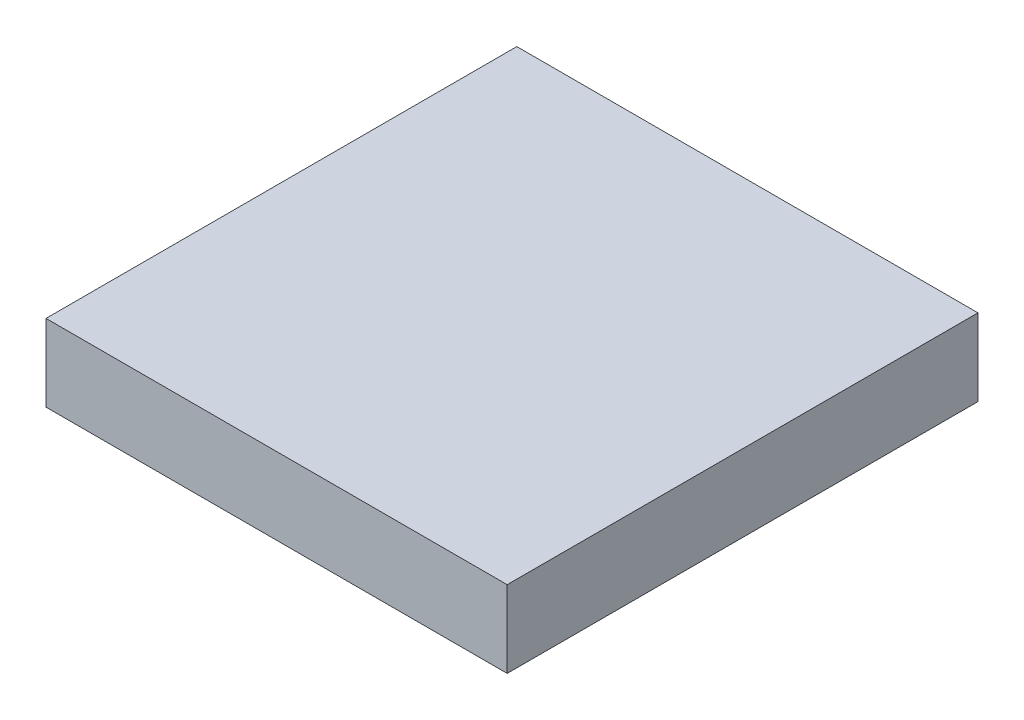
ISO-10303-21;
HEADER;
FILE_DESCRIPTION(('STEP AP214'),'2;1');
FILE_NAME('part.step','',(''),(''),'','','');
FILE_SCHEMA(('AUTOMOTIVE_DESIGN { 1 0 10303 214 1 1 1 1 }'));
ENDSEC;
DATA;
#1=APPLICATION_CONTEXT('core data for automotive mechanical design processes');
#2=APPLICATION_PROTOCOL_DEFINITION('international standard','automotive_design',2000,#1);
#3=PRODUCT_CONTEXT('',#1,'mechanical');
#4=PRODUCT('Part','Part','',(#3));
#5=PRODUCT_RELATED_PRODUCT_CATEGORY('part','',(#4));
#6=PRODUCT_DEFINITION_FORMATION('','',#4);
#7=PRODUCT_DEFINITION_CONTEXT('part definition',#1,'design');
#8=PRODUCT_DEFINITION('design','',#6,#7);
#9=PRODUCT_DEFINITION_SHAPE('','',#8);
#10=(LENGTH_UNIT() NAMED_UNIT(*) SI_UNIT(.MILLI.,.METRE.));
#11=(NAMED_UNIT(*) PLANE_ANGLE_UNIT() SI_UNIT($,.RADIAN.));
#12=(NAMED_UNIT(*) SI_UNIT($,.STERADIAN.) SOLID_ANGLE_UNIT());
#13=UNCERTAINTY_MEASURE_WITH_UNIT(LENGTH_MEASURE(1.E-05),#10,'distance_accuracy_value','');
#14=(GEOMETRIC_REPRESENTATION_CONTEXT(3) GLOBAL_UNCERTAINTY_ASSIGNED_CONTEXT((#13)) GLOBAL_UNIT_ASSIGNED_CONTEXT((#10,
#11,#12)) REPRESENTATION_CONTEXT('',''));
#15=CARTESIAN_POINT('',(0.,0.,0.));
#16=DIRECTION('',(0.,0.,1.));
#17=DIRECTION('',(1.,0.,0.));
#18=AXIS2_PLACEMENT_3D('',#15,#16,#17);
#19=CARTESIAN_POINT('',(0.,20.,0.));
#20=DIRECTION('',(1.,0.,0.));
#21=DIRECTION('',(0.,0.,-1.));
#22=AXIS2_PLACEMENT_3D('',#19,#20,#21);
#23=PLANE('',#22);
#24=DIRECTION('',(0.,0.,1.));
#25=VECTOR('',#24,1.);
#26=CARTESIAN_POINT('',(0.,0.,0.));
#27=LINE('',#26,#25);
#28=CARTESIAN_POINT('',(0.,0.,-122.5));
#29=VERTEX_POINT('',#28);
#30=CARTESIAN_POINT('',(0.,0.,0.));
#31=VERTEX_POINT('',#30);
#32=EDGE_CURVE('E144',#29,#31,#27,.T.);
#33=ORIENTED_EDGE('',*,*,#32,.T.);
#34=DIRECTION('',(0.,-1.,0.));
#35=VECTOR('',#34,1.);
#36=CARTESIAN_POINT('',(0.,20.,0.));
#37=LINE('',#36,#35);
#38=CARTESIAN_POINT('',(0.,20.,0.));
#39=VERTEX_POINT('',#38);
#40=EDGE_CURVE('E12',#39,#31,#37,.T.);
#41=ORIENTED_EDGE('',*,*,#40,.F.);
#42=DIRECTION('',(0.,0.,1.));
#43=VECTOR('',#42,1.);
#44=CARTESIAN_POINT('',(0.,20.,0.));
#45=LINE('',#44,#43);
#46=CARTESIAN_POINT('',(0.,20.,-122.5));
#47=VERTEX_POINT('',#46);
#48=EDGE_CURVE('E146',#47,#39,#45,.T.);
#49=ORIENTED_EDGE('',*,*,#48,.F.);
#50=DIRECTION('',(0.,-1.,0.));
#51=VECTOR('',#50,1.);
#52=CARTESIAN_POINT('',(0.,20.,-122.5));
#53=LINE('',#52,#51);
#54=EDGE_CURVE('E152',#47,#29,#53,.T.);
#55=ORIENTED_EDGE('',*,*,#54,.T.);
#56=EDGE_LOOP('',(#33,#41,#49,#55));
#57=FACE_BOUND('',#56,.T.);
#58=ADVANCED_FACE('F37',(#57),#23,.F.);
#59=CARTESIAN_POINT('',(0.,20.,0.));
#60=DIRECTION('',(0.,0.,-1.));
#61=DIRECTION('',(-1.,0.,0.));
#62=AXIS2_PLACEMENT_3D('',#59,#60,#61);
#63=PLANE('',#62);
#64=DIRECTION('',(1.,0.,0.));
#65=VECTOR('',#64,1.);
#66=CARTESIAN_POINT('',(0.,0.,0.));
#67=LINE('',#66,#65);
#68=CARTESIAN_POINT('',(120.,0.,0.));
#69=VERTEX_POINT('',#68);
#70=EDGE_CURVE('E155',#31,#69,#67,.T.);
#71=ORIENTED_EDGE('',*,*,#70,.T.);
#72=DIRECTION('',(0.,-1.,0.));
#73=VECTOR('',#72,1.);
#74=CARTESIAN_POINT('',(120.,20.,0.));
#75=LINE('',#74,#73);
#76=CARTESIAN_POINT('',(120.,20.,0.));
#77=VERTEX_POINT('',#76);
#78=EDGE_CURVE('E44',#77,#69,#75,.T.);
#79=ORIENTED_EDGE('',*,*,#78,.F.);
#80=DIRECTION('',(1.,0.,0.));
#81=VECTOR('',#80,1.);
#82=CARTESIAN_POINT('',(0.,20.,0.));
#83=LINE('',#82,#81);
#84=EDGE_CURVE('E88',#39,#77,#83,.T.);
#85=ORIENTED_EDGE('',*,*,#84,.F.);
#86=ORIENTED_EDGE('',*,*,#40,.T.);
#87=EDGE_LOOP('',(#71,#79,#85,#86));
#88=FACE_BOUND('',#87,.T.);
#89=ADVANCED_FACE('F181',(#88),#63,.F.);
#90=CARTESIAN_POINT('',(120.,20.,0.));
#91=DIRECTION('',(-1.,0.,0.));
#92=DIRECTION('',(0.,0.,1.));
#93=AXIS2_PLACEMENT_3D('',#90,#91,#92);
#94=PLANE('',#93);
#95=DIRECTION('',(0.,0.,-1.));
#96=VECTOR('',#95,1.);
#97=CARTESIAN_POINT('',(120.,0.,0.));
#98=LINE('',#97,#96);
#99=CARTESIAN_POINT('',(120.,0.,-122.5));
#100=VERTEX_POINT('',#99);
#101=EDGE_CURVE('E157',#69,#100,#98,.T.);
#102=ORIENTED_EDGE('',*,*,#101,.T.);
#103=DIRECTION('',(0.,-1.,0.));
#104=VECTOR('',#103,1.);
#105=CARTESIAN_POINT('',(120.,20.,-122.5));
#106=LINE('',#105,#104);
#107=CARTESIAN_POINT('',(120.,20.,-122.5));
#108=VERTEX_POINT('',#107);
#109=EDGE_CURVE('E161',#108,#100,#106,.T.);
#110=ORIENTED_EDGE('',*,*,#109,.F.);
#111=DIRECTION('',(0.,0.,-1.));
#112=VECTOR('',#111,1.);
#113=CARTESIAN_POINT('',(120.,20.,0.));
#114=LINE('',#113,#112);
#115=EDGE_CURVE('E149',#77,#108,#114,.T.);
#116=ORIENTED_EDGE('',*,*,#115,.F.);
#117=ORIENTED_EDGE('',*,*,#78,.T.);
#118=EDGE_LOOP('',(#102,#110,#116,#117));
#119=FACE_BOUND('',#118,.T.);
#120=ADVANCED_FACE('F166',(#119),#94,.F.);
#121=CARTESIAN_POINT('',(0.,20.,-122.5));
#122=DIRECTION('',(0.,0.,1.));
#123=DIRECTION('',(1.,0.,0.));
#124=AXIS2_PLACEMENT_3D('',#121,#122,#123);
#125=PLANE('',#124);
#126=DIRECTION('',(-1.,0.,0.));
#127=VECTOR('',#126,1.);
#128=CARTESIAN_POINT('',(0.,0.,-122.5));
#129=LINE('',#128,#127);
#130=EDGE_CURVE('E81',#100,#29,#129,.T.);
#131=ORIENTED_EDGE('',*,*,#130,.T.);
#132=ORIENTED_EDGE('',*,*,#54,.F.);
#133=DIRECTION('',(-1.,0.,0.));
#134=VECTOR('',#133,1.);
#135=CARTESIAN_POINT('',(0.,20.,-122.5));
#136=LINE('',#135,#134);
#137=EDGE_CURVE('E60',#108,#47,#136,.T.);
#138=ORIENTED_EDGE('',*,*,#137,.F.);
#139=ORIENTED_EDGE('',*,*,#109,.T.);
#140=EDGE_LOOP('',(#131,#132,#138,#139));
#141=FACE_BOUND('',#140,.T.);
#142=ADVANCED_FACE('F172',(#141),#125,.F.);
#143=CARTESIAN_POINT('',(0.,20.,0.));
#144=DIRECTION('',(0.,-1.,0.));
#145=DIRECTION('',(0.,0.,-1.));
#146=AXIS2_PLACEMENT_3D('',#143,#144,#145);
#147=PLANE('',#146);
#148=ORIENTED_EDGE('',*,*,#48,.T.);
#149=ORIENTED_EDGE('',*,*,#84,.T.);
#150=ORIENTED_EDGE('',*,*,#115,.T.);
#151=ORIENTED_EDGE('',*,*,#137,.T.);
#152=EDGE_LOOP('',(#148,#149,#150,#151));
#153=FACE_BOUND('',#152,.T.);
#154=ADVANCED_FACE('F174',(#153),#147,.F.);
#155=CARTESIAN_POINT('',(0.,0.,0.));
#156=DIRECTION('',(0.,-1.,0.));
#157=DIRECTION('',(0.,0.,-1.));
#158=AXIS2_PLACEMENT_3D('',#155,#156,#157);
#159=PLANE('',#158);
#160=DIRECTION('',(-1.,0.,0.));
#161=VECTOR('',#160,1.);
#162=CARTESIAN_POINT('',(119.,0.,-1.));
#163=LINE('',#162,#161);
#164=CARTESIAN_POINT('',(119.,0.,-1.));
#165=VERTEX_POINT('',#164);
#166=CARTESIAN_POINT('',(1.,0.,-1.));
#167=VERTEX_POINT('',#166);
#168=EDGE_CURVE('E51',#165,#167,#163,.T.);
#169=ORIENTED_EDGE('',*,*,#168,.F.);
#170=DIRECTION('',(0.,0.,1.));
#171=VECTOR('',#170,1.);
#172=CARTESIAN_POINT('',(119.,0.,-121.5));
#173=LINE('',#172,#171);
#174=CARTESIAN_POINT('',(119.,0.,-121.5));
#175=VERTEX_POINT('',#174);
#176=EDGE_CURVE('E133',#175,#165,#173,.T.);
#177=ORIENTED_EDGE('',*,*,#176,.F.);
#178=DIRECTION('',(1.,0.,0.));
#179=VECTOR('',#178,1.);
#180=CARTESIAN_POINT('',(1.,0.,-121.5));
#181=LINE('',#180,#179);
#182=CARTESIAN_POINT('',(1.,0.,-121.5));
#183=VERTEX_POINT('',#182);
#184=EDGE_CURVE('E116',#183,#175,#181,.T.);
#185=ORIENTED_EDGE('',*,*,#184,.F.);
#186=DIRECTION('',(0.,0.,-1.));
#187=VECTOR('',#186,1.);
#188=CARTESIAN_POINT('',(1.,0.,-1.));
#189=LINE('',#188,#187);
#190=EDGE_CURVE('E126',#167,#183,#189,.T.);
#191=ORIENTED_EDGE('',*,*,#190,.F.);
#192=EDGE_LOOP('',(#169,#177,#185,#191));
#193=FACE_BOUND('',#192,.T.);
#194=ORIENTED_EDGE('',*,*,#32,.F.);
#195=ORIENTED_EDGE('',*,*,#130,.F.);
#196=ORIENTED_EDGE('',*,*,#101,.F.);
#197=ORIENTED_EDGE('',*,*,#70,.F.);
#198=EDGE_LOOP('',(#194,#195,#196,#197));
#199=FACE_BOUND('',#198,.T.);
#200=ADVANCED_FACE('F130',(#193,#199),#159,.T.);
#201=CARTESIAN_POINT('',(119.,188.654232084463,-1.));
#202=DIRECTION('',(0.,0.,1.));
#203=DIRECTION('',(1.,0.,0.));
#204=AXIS2_PLACEMENT_3D('',#201,#202,#203);
#205=PLANE('',#204);
#206=DIRECTION('',(1.,0.,0.));
#207=VECTOR('',#206,1.);
#208=CARTESIAN_POINT('',(119.,19.,-1.));
#209=LINE('',#208,#207);
#210=CARTESIAN_POINT('',(1.,19.,-1.));
#211=VERTEX_POINT('',#210);
#212=CARTESIAN_POINT('',(119.,19.,-1.));
#213=VERTEX_POINT('',#212);
#214=EDGE_CURVE('E145',#211,#213,#209,.T.);
#215=ORIENTED_EDGE('',*,*,#214,.T.);
#216=DIRECTION('',(0.,-1.,0.));
#217=VECTOR('',#216,1.);
#218=CARTESIAN_POINT('',(119.,188.654232084463,-1.));
#219=LINE('',#218,#217);
#220=EDGE_CURVE('E138',#213,#165,#219,.T.);
#221=ORIENTED_EDGE('',*,*,#220,.T.);
#222=ORIENTED_EDGE('',*,*,#168,.T.);
#223=DIRECTION('',(0.,-1.,0.));
#224=VECTOR('',#223,1.);
#225=CARTESIAN_POINT('',(1.,188.654232084463,-1.));
#226=LINE('',#225,#224);
#227=EDGE_CURVE('E123',#211,#167,#226,.T.);
#228=ORIENTED_EDGE('',*,*,#227,.F.);
#229=EDGE_LOOP('',(#215,#221,#222,#228));
#230=FACE_BOUND('',#229,.T.);
#231=ADVANCED_FACE('F213',(#230),#205,.F.);
#232=CARTESIAN_POINT('',(119.,188.654232084463,-121.5));
#233=DIRECTION('',(1.,0.,0.));
#234=DIRECTION('',(0.,0.,-1.));
#235=AXIS2_PLACEMENT_3D('',#232,#233,#234);
#236=PLANE('',#235);
#237=DIRECTION('',(0.,0.,-1.));
#238=VECTOR('',#237,1.);
#239=CARTESIAN_POINT('',(119.,19.,-121.5));
#240=LINE('',#239,#238);
#241=CARTESIAN_POINT('',(119.,19.,-121.5));
#242=VERTEX_POINT('',#241);
#243=EDGE_CURVE('E262',#213,#242,#240,.T.);
#244=ORIENTED_EDGE('',*,*,#243,.T.);
#245=DIRECTION('',(0.,-1.,0.));
#246=VECTOR('',#245,1.);
#247=CARTESIAN_POINT('',(119.,188.654232084463,-121.5));
#248=LINE('',#247,#246);
#249=EDGE_CURVE('E122',#242,#175,#248,.T.);
#250=ORIENTED_EDGE('',*,*,#249,.T.);
#251=ORIENTED_EDGE('',*,*,#176,.T.);
#252=ORIENTED_EDGE('',*,*,#220,.F.);
#253=EDGE_LOOP('',(#244,#250,#251,#252));
#254=FACE_BOUND('',#253,.T.);
#255=ADVANCED_FACE('F221',(#254),#236,.F.);
#256=CARTESIAN_POINT('',(1.,188.654232084463,-121.5));
#257=DIRECTION('',(0.,0.,-1.));
#258=DIRECTION('',(-1.,0.,0.));
#259=AXIS2_PLACEMENT_3D('',#256,#257,#258);
#260=PLANE('',#259);
#261=DIRECTION('',(-1.,0.,0.));
#262=VECTOR('',#261,1.);
#263=CARTESIAN_POINT('',(1.,19.,-121.5));
#264=LINE('',#263,#262);
#265=CARTESIAN_POINT('',(1.,19.,-121.5));
#266=VERTEX_POINT('',#265);
#267=EDGE_CURVE('E119',#242,#266,#264,.T.);
#268=ORIENTED_EDGE('',*,*,#267,.T.);
#269=DIRECTION('',(0.,-1.,0.));
#270=VECTOR('',#269,1.);
#271=CARTESIAN_POINT('',(1.,188.654232084463,-121.5));
#272=LINE('',#271,#270);
#273=EDGE_CURVE('E111',#266,#183,#272,.T.);
#274=ORIENTED_EDGE('',*,*,#273,.T.);
#275=ORIENTED_EDGE('',*,*,#184,.T.);
#276=ORIENTED_EDGE('',*,*,#249,.F.);
#277=EDGE_LOOP('',(#268,#274,#275,#276));
#278=FACE_BOUND('',#277,.T.);
#279=ADVANCED_FACE('F113',(#278),#260,.F.);
#280=CARTESIAN_POINT('',(1.,188.654232084463,-1.));
#281=DIRECTION('',(-1.,0.,0.));
#282=DIRECTION('',(0.,0.,1.));
#283=AXIS2_PLACEMENT_3D('',#280,#281,#282);
#284=PLANE('',#283);
#285=DIRECTION('',(0.,0.,1.));
#286=VECTOR('',#285,1.);
#287=CARTESIAN_POINT('',(1.,19.,-1.));
#288=LINE('',#287,#286);
#289=EDGE_CURVE('E142',#266,#211,#288,.T.);
#290=ORIENTED_EDGE('',*,*,#289,.T.);
#291=ORIENTED_EDGE('',*,*,#227,.T.);
#292=ORIENTED_EDGE('',*,*,#190,.T.);
#293=ORIENTED_EDGE('',*,*,#273,.F.);
#294=EDGE_LOOP('',(#290,#291,#292,#293));
#295=FACE_BOUND('',#294,.T.);
#296=ADVANCED_FACE('F127',(#295),#284,.F.);
#297=CARTESIAN_POINT('',(0.,19.,0.));
#298=DIRECTION('',(0.,-1.,0.));
#299=DIRECTION('',(0.,0.,-1.));
#300=AXIS2_PLACEMENT_3D('',#297,#298,#299);
#301=PLANE('',#300);
#302=ORIENTED_EDGE('',*,*,#214,.F.);
#303=ORIENTED_EDGE('',*,*,#289,.F.);
#304=ORIENTED_EDGE('',*,*,#267,.F.);
#305=ORIENTED_EDGE('',*,*,#243,.F.);
#306=EDGE_LOOP('',(#302,#303,#304,#305));
#307=FACE_BOUND('',#306,.T.);
#308=ADVANCED_FACE('F247',(#307),#301,.T.);
#309=CLOSED_SHELL('',(#58,#89,#120,#142,#154,#200,#231,#255,#279,#296,#308));
#310=MANIFOLD_SOLID_BREP('B2',#309);
#311=ADVANCED_BREP_SHAPE_REPRESENTATION('',(#18,#310),#14);
#312=SHAPE_DEFINITION_REPRESENTATION(#9,#311);
ENDSEC;
END-ISO-10303-21;
